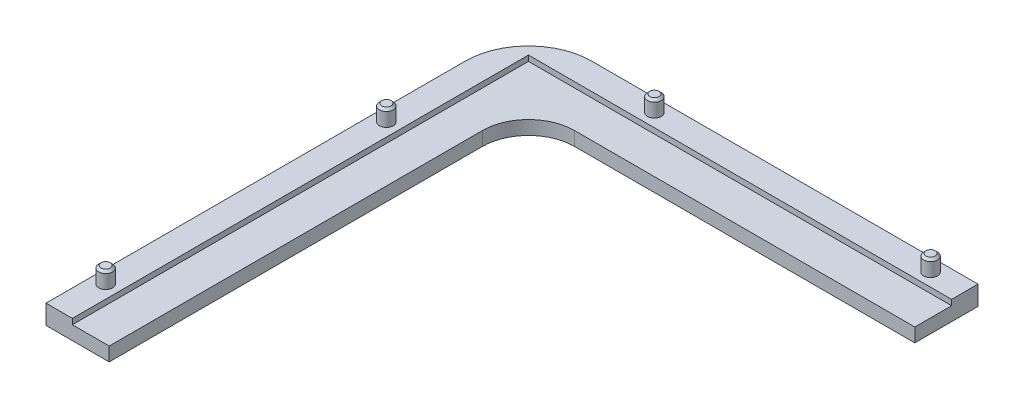
ISO-10303-21;
HEADER;
FILE_DESCRIPTION(('STEP AP214'),'2;1');
FILE_NAME('part.step','',(''),(''),'','','');
FILE_SCHEMA(('AUTOMOTIVE_DESIGN { 1 0 10303 214 1 1 1 1 }'));
ENDSEC;
DATA;
#1=APPLICATION_CONTEXT('core data for automotive mechanical design processes');
#2=APPLICATION_PROTOCOL_DEFINITION('international standard','automotive_design',2000,#1);
#3=PRODUCT_CONTEXT('',#1,'mechanical');
#4=PRODUCT('Part','Part','',(#3));
#5=PRODUCT_RELATED_PRODUCT_CATEGORY('part','',(#4));
#6=PRODUCT_DEFINITION_FORMATION('','',#4);
#7=PRODUCT_DEFINITION_CONTEXT('part definition',#1,'design');
#8=PRODUCT_DEFINITION('design','',#6,#7);
#9=PRODUCT_DEFINITION_SHAPE('','',#8);
#10=(LENGTH_UNIT() NAMED_UNIT(*) SI_UNIT(.MILLI.,.METRE.));
#11=(NAMED_UNIT(*) PLANE_ANGLE_UNIT() SI_UNIT($,.RADIAN.));
#12=(NAMED_UNIT(*) SI_UNIT($,.STERADIAN.) SOLID_ANGLE_UNIT());
#13=UNCERTAINTY_MEASURE_WITH_UNIT(LENGTH_MEASURE(1.E-05),#10,'distance_accuracy_value','');
#14=(GEOMETRIC_REPRESENTATION_CONTEXT(3) GLOBAL_UNCERTAINTY_ASSIGNED_CONTEXT((#13)) GLOBAL_UNIT_ASSIGNED_CONTEXT((#10,
#11,#12)) REPRESENTATION_CONTEXT('',''));
#15=CARTESIAN_POINT('',(0.,0.,0.));
#16=DIRECTION('',(0.,0.,1.));
#17=DIRECTION('',(1.,0.,0.));
#18=AXIS2_PLACEMENT_3D('',#15,#16,#17);
#19=CARTESIAN_POINT('',(114.5,-1.2,178.));
#20=DIRECTION('',(0.,-1.,0.));
#21=DIRECTION('',(0.,0.,-1.));
#22=AXIS2_PLACEMENT_3D('',#19,#20,#21);
#23=PLANE('',#22);
#24=DIRECTION('',(1.,0.,0.));
#25=VECTOR('',#24,1.);
#26=CARTESIAN_POINT('',(7.99999999999999,-1.2,8.00000000000001));
#27=LINE('',#26,#25);
#28=CARTESIAN_POINT('',(18.,-1.2,8.00000000000001));
#29=VERTEX_POINT('',#28);
#30=CARTESIAN_POINT('',(91.9392474706588,-1.19999999999999,8.00000000000001));
#31=VERTEX_POINT('',#30);
#32=EDGE_CURVE('E192',#29,#31,#27,.T.);
#33=ORIENTED_EDGE('',*,*,#32,.T.);
#34=DIRECTION('',(0.,0.,-1.));
#35=VECTOR('',#34,1.);
#36=CARTESIAN_POINT('',(91.9392474706588,-1.2,178.));
#37=LINE('',#36,#35);
#38=CARTESIAN_POINT('',(91.9392474706588,-1.2,0.));
#39=VERTEX_POINT('',#38);
#40=EDGE_CURVE('E188',#31,#39,#37,.T.);
#41=ORIENTED_EDGE('',*,*,#40,.T.);
#42=DIRECTION('',(1.,0.,0.));
#43=VECTOR('',#42,1.);
#44=CARTESIAN_POINT('',(7.99999999999999,-1.2,0.));
#45=LINE('',#44,#43);
#46=CARTESIAN_POINT('',(0.,-1.2,0.));
#47=VERTEX_POINT('',#46);
#48=EDGE_CURVE('E199',#47,#39,#45,.T.);
#49=ORIENTED_EDGE('',*,*,#48,.F.);
#50=DIRECTION('',(0.,0.,-1.));
#51=VECTOR('',#50,1.);
#52=CARTESIAN_POINT('',(0.,-1.2,170.));
#53=LINE('',#52,#51);
#54=CARTESIAN_POINT('',(0.,-1.2,99.0984832904773));
#55=VERTEX_POINT('',#54);
#56=EDGE_CURVE('E152',#55,#47,#53,.T.);
#57=ORIENTED_EDGE('',*,*,#56,.F.);
#58=DIRECTION('',(-1.,0.,0.));
#59=VECTOR('',#58,1.);
#60=CARTESIAN_POINT('',(114.5,-1.19999999999999,99.0984832904773));
#61=LINE('',#60,#59);
#62=CARTESIAN_POINT('',(8.00000000000002,-1.19999999999999,99.0984832904773));
#63=VERTEX_POINT('',#62);
#64=EDGE_CURVE('E203',#63,#55,#61,.T.);
#65=ORIENTED_EDGE('',*,*,#64,.F.);
#66=DIRECTION('',(0.,0.,-1.));
#67=VECTOR('',#66,1.);
#68=CARTESIAN_POINT('',(8.00000000000004,-1.2,170.));
#69=LINE('',#68,#67);
#70=CARTESIAN_POINT('',(8.00000000000002,-1.2,18.));
#71=VERTEX_POINT('',#70);
#72=EDGE_CURVE('E191',#63,#71,#69,.T.);
#73=ORIENTED_EDGE('',*,*,#72,.T.);
#74=CARTESIAN_POINT('',(18.,-1.19999999999999,18.));
#75=DIRECTION('',(0.,-1.,0.));
#76=DIRECTION('',(0.,0.,-1.));
#77=AXIS2_PLACEMENT_3D('',#74,#75,#76);
#78=CIRCLE('',#77,10.);
#79=EDGE_CURVE('E180',#71,#29,#78,.T.);
#80=ORIENTED_EDGE('',*,*,#79,.T.);
#81=EDGE_LOOP('',(#33,#41,#49,#57,#65,#73,#80));
#82=FACE_BOUND('',#81,.T.);
#83=ADVANCED_FACE('F44',(#82),#23,.F.);
#84=CARTESIAN_POINT('',(-5.72893887195666,-4.2,170.));
#85=DIRECTION('',(1.,0.,0.));
#86=DIRECTION('',(0.,0.,-1.));
#87=AXIS2_PLACEMENT_3D('',#84,#85,#86);
#88=PLANE('',#87);
#89=DIRECTION('',(0.,-1.,0.));
#90=VECTOR('',#89,1.);
#91=CARTESIAN_POINT('',(-5.72893887195667,-4.2,99.0984832904773));
#92=LINE('',#91,#90);
#93=CARTESIAN_POINT('',(-5.72893887195669,0.,99.0984832904773));
#94=VERTEX_POINT('',#93);
#95=CARTESIAN_POINT('',(-5.72893887195669,-4.2,99.0984832904773));
#96=VERTEX_POINT('',#95);
#97=EDGE_CURVE('E55',#94,#96,#92,.T.);
#98=ORIENTED_EDGE('',*,*,#97,.F.);
#99=DIRECTION('',(0.,0.,-1.));
#100=VECTOR('',#99,1.);
#101=CARTESIAN_POINT('',(-5.72893887195668,0.,183.728938871957));
#102=LINE('',#101,#100);
#103=CARTESIAN_POINT('',(-5.72893887195668,0.,8.));
#104=VERTEX_POINT('',#103);
#105=EDGE_CURVE('E174',#94,#104,#102,.T.);
#106=ORIENTED_EDGE('',*,*,#105,.T.);
#107=DIRECTION('',(0.,-1.,0.));
#108=VECTOR('',#107,1.);
#109=CARTESIAN_POINT('',(-5.72893887195669,-4.2,7.99999999999999));
#110=LINE('',#109,#108);
#111=CARTESIAN_POINT('',(-5.72893887195668,-4.2,7.99999999999998));
#112=VERTEX_POINT('',#111);
#113=EDGE_CURVE('E169',#104,#112,#110,.T.);
#114=ORIENTED_EDGE('',*,*,#113,.T.);
#115=DIRECTION('',(0.,0.,-1.));
#116=VECTOR('',#115,1.);
#117=CARTESIAN_POINT('',(-5.72893887195666,-4.2,170.));
#118=LINE('',#117,#116);
#119=EDGE_CURVE('E166',#96,#112,#118,.T.);
#120=ORIENTED_EDGE('',*,*,#119,.F.);
#121=EDGE_LOOP('',(#98,#106,#114,#120));
#122=FACE_BOUND('',#121,.T.);
#123=ADVANCED_FACE('F329',(#122),#88,.F.);
#124=CARTESIAN_POINT('',(8.00000000000004,-4.2,170.));
#125=DIRECTION('',(-1.,0.,0.));
#126=DIRECTION('',(0.,0.,1.));
#127=AXIS2_PLACEMENT_3D('',#124,#125,#126);
#128=PLANE('',#127);
#129=DIRECTION('',(0.,1.,0.));
#130=VECTOR('',#129,1.);
#131=CARTESIAN_POINT('',(8.00000000000003,-4.2,99.0984832904773));
#132=LINE('',#131,#130);
#133=CARTESIAN_POINT('',(8.00000000000004,-4.2,99.0984832904773));
#134=VERTEX_POINT('',#133);
#135=EDGE_CURVE('E200',#134,#63,#132,.T.);
#136=ORIENTED_EDGE('',*,*,#135,.F.);
#137=DIRECTION('',(0.,0.,-1.));
#138=VECTOR('',#137,1.);
#139=CARTESIAN_POINT('',(8.00000000000004,-4.2,170.));
#140=LINE('',#139,#138);
#141=CARTESIAN_POINT('',(8.00000000000002,-4.2,18.));
#142=VERTEX_POINT('',#141);
#143=EDGE_CURVE('E173',#134,#142,#140,.T.);
#144=ORIENTED_EDGE('',*,*,#143,.T.);
#145=DIRECTION('',(0.,1.,0.));
#146=VECTOR('',#145,1.);
#147=CARTESIAN_POINT('',(8.00000000000002,-1.2,18.));
#148=LINE('',#147,#146);
#149=EDGE_CURVE('E272',#142,#71,#148,.T.);
#150=ORIENTED_EDGE('',*,*,#149,.T.);
#151=ORIENTED_EDGE('',*,*,#72,.F.);
#152=EDGE_LOOP('',(#136,#144,#150,#151));
#153=FACE_BOUND('',#152,.T.);
#154=ADVANCED_FACE('F300',(#153),#128,.F.);
#155=CARTESIAN_POINT('',(0.,0.,170.));
#156=DIRECTION('',(-1.,0.,0.));
#157=DIRECTION('',(0.,0.,1.));
#158=AXIS2_PLACEMENT_3D('',#155,#156,#157);
#159=PLANE('',#158);
#160=DIRECTION('',(0.,1.,0.));
#161=VECTOR('',#160,1.);
#162=CARTESIAN_POINT('',(0.,0.,99.0984832904773));
#163=LINE('',#162,#161);
#164=CARTESIAN_POINT('',(0.,0.,99.0984832904773));
#165=VERTEX_POINT('',#164);
#166=EDGE_CURVE('E207',#55,#165,#163,.T.);
#167=ORIENTED_EDGE('',*,*,#166,.F.);
#168=ORIENTED_EDGE('',*,*,#56,.T.);
#169=DIRECTION('',(0.,1.,0.));
#170=VECTOR('',#169,1.);
#171=CARTESIAN_POINT('',(0.,-1.2,0.));
#172=LINE('',#171,#170);
#173=CARTESIAN_POINT('',(0.,0.,0.));
#174=VERTEX_POINT('',#173);
#175=EDGE_CURVE('E148',#47,#174,#172,.T.);
#176=ORIENTED_EDGE('',*,*,#175,.T.);
#177=DIRECTION('',(0.,0.,-1.));
#178=VECTOR('',#177,1.);
#179=CARTESIAN_POINT('',(0.,0.,170.));
#180=LINE('',#179,#178);
#181=EDGE_CURVE('E182',#165,#174,#180,.T.);
#182=ORIENTED_EDGE('',*,*,#181,.F.);
#183=EDGE_LOOP('',(#167,#168,#176,#182));
#184=FACE_BOUND('',#183,.T.);
#185=ADVANCED_FACE('F336',(#184),#159,.F.);
#186=CARTESIAN_POINT('',(221.,-4.2,170.));
#187=DIRECTION('',(0.,1.,0.));
#188=DIRECTION('',(0.,0.,1.));
#189=AXIS2_PLACEMENT_3D('',#186,#187,#188);
#190=PLANE('',#189);
#191=DIRECTION('',(1.,0.,0.));
#192=VECTOR('',#191,1.);
#193=CARTESIAN_POINT('',(7.99999999999999,-4.2,-5.72893887195669));
#194=LINE('',#193,#192);
#195=CARTESIAN_POINT('',(7.99999999999999,-4.2,-5.72893887195669));
#196=VERTEX_POINT('',#195);
#197=CARTESIAN_POINT('',(91.9392474706588,-4.2,-5.72893887195669));
#198=VERTEX_POINT('',#197);
#199=EDGE_CURVE('E134',#196,#198,#194,.T.);
#200=ORIENTED_EDGE('',*,*,#199,.T.);
#201=DIRECTION('',(0.,0.,1.));
#202=VECTOR('',#201,1.);
#203=CARTESIAN_POINT('',(91.9392474706588,-4.2,0.));
#204=LINE('',#203,#202);
#205=CARTESIAN_POINT('',(91.9392474706588,-4.2,8.00000000000001));
#206=VERTEX_POINT('',#205);
#207=EDGE_CURVE('E48',#198,#206,#204,.T.);
#208=ORIENTED_EDGE('',*,*,#207,.T.);
#209=DIRECTION('',(1.,0.,0.));
#210=VECTOR('',#209,1.);
#211=CARTESIAN_POINT('',(7.99999999999999,-4.2,8.00000000000001));
#212=LINE('',#211,#210);
#213=CARTESIAN_POINT('',(18.,-4.2,8.00000000000001));
#214=VERTEX_POINT('',#213);
#215=EDGE_CURVE('E143',#214,#206,#212,.T.);
#216=ORIENTED_EDGE('',*,*,#215,.F.);
#217=CARTESIAN_POINT('',(18.,-4.19999999999999,18.));
#218=DIRECTION('',(0.,1.,0.));
#219=DIRECTION('',(0.,0.,1.));
#220=AXIS2_PLACEMENT_3D('',#217,#218,#219);
#221=CIRCLE('',#220,10.);
#222=EDGE_CURVE('E133',#214,#142,#221,.T.);
#223=ORIENTED_EDGE('',*,*,#222,.T.);
#224=ORIENTED_EDGE('',*,*,#143,.F.);
#225=DIRECTION('',(1.,0.,0.));
#226=VECTOR('',#225,1.);
#227=CARTESIAN_POINT('',(0.,-4.2,99.0984832904773));
#228=LINE('',#227,#226);
#229=EDGE_CURVE('E11',#96,#134,#228,.T.);
#230=ORIENTED_EDGE('',*,*,#229,.F.);
#231=ORIENTED_EDGE('',*,*,#119,.T.);
#232=DIRECTION('',(1.,0.,0.));
#233=VECTOR('',#232,1.);
#234=CARTESIAN_POINT('',(8.00000000000001,-4.2,7.99999999999999));
#235=LINE('',#234,#233);
#236=CARTESIAN_POINT('',(8.00000000000001,-4.2,7.99999999999998));
#237=VERTEX_POINT('',#236);
#238=EDGE_CURVE('E156',#112,#237,#235,.T.);
#239=ORIENTED_EDGE('',*,*,#238,.T.);
#240=DIRECTION('',(0.,0.,1.));
#241=VECTOR('',#240,1.);
#242=CARTESIAN_POINT('',(7.99999999999999,-4.2,8.00000000000001));
#243=LINE('',#242,#241);
#244=EDGE_CURVE('E144',#196,#237,#243,.T.);
#245=ORIENTED_EDGE('',*,*,#244,.F.);
#246=EDGE_LOOP('',(#200,#208,#216,#223,#224,#230,#231,#239,#245));
#247=FACE_BOUND('',#246,.T.);
#248=ADVANCED_FACE('F46',(#247),#190,.F.);
#249=CARTESIAN_POINT('',(8.,0.,8.));
#250=DIRECTION('',(0.,-1.,0.));
#251=DIRECTION('',(0.,0.,-1.));
#252=AXIS2_PLACEMENT_3D('',#249,#250,#251);
#253=CYLINDRICAL_SURFACE('',#252,13.7289388719567);
#254=ORIENTED_EDGE('',*,*,#113,.F.);
#255=CARTESIAN_POINT('',(8.,0.,8.));
#256=DIRECTION('',(0.,-1.,0.));
#257=DIRECTION('',(0.,0.,-1.));
#258=AXIS2_PLACEMENT_3D('',#255,#256,#257);
#259=CIRCLE('',#258,13.7289388719567);
#260=CARTESIAN_POINT('',(7.99999999999998,0.,-5.72893887195669));
#261=VERTEX_POINT('',#260);
#262=EDGE_CURVE('E165',#104,#261,#259,.T.);
#263=ORIENTED_EDGE('',*,*,#262,.T.);
#264=DIRECTION('',(0.,-1.,0.));
#265=VECTOR('',#264,1.);
#266=CARTESIAN_POINT('',(7.99999999999999,-4.2,-5.72893887195669));
#267=LINE('',#266,#265);
#268=EDGE_CURVE('E162',#261,#196,#267,.T.);
#269=ORIENTED_EDGE('',*,*,#268,.T.);
#270=CARTESIAN_POINT('',(8.,-4.2,8.));
#271=DIRECTION('',(0.,-1.,0.));
#272=DIRECTION('',(-1.,0.,0.));
#273=AXIS2_PLACEMENT_3D('',#270,#271,#272);
#274=CIRCLE('',#273,13.7289388719567);
#275=EDGE_CURVE('E158',#112,#196,#274,.T.);
#276=ORIENTED_EDGE('',*,*,#275,.F.);
#277=EDGE_LOOP('',(#254,#263,#269,#276));
#278=FACE_BOUND('',#277,.T.);
#279=ADVANCED_FACE('F542',(#278),#253,.T.);
#280=CARTESIAN_POINT('',(8.00000000000001,-4.2,7.99999999999999));
#281=DIRECTION('',(0.,1.,0.));
#282=DIRECTION('',(0.,0.,1.));
#283=AXIS2_PLACEMENT_3D('',#280,#281,#282);
#284=PLANE('',#283);
#285=ORIENTED_EDGE('',*,*,#238,.F.);
#286=ORIENTED_EDGE('',*,*,#275,.T.);
#287=ORIENTED_EDGE('',*,*,#244,.T.);
#288=EDGE_LOOP('',(#285,#286,#287));
#289=FACE_BOUND('',#288,.T.);
#290=ADVANCED_FACE('F324',(#289),#284,.F.);
#291=CARTESIAN_POINT('',(7.99999999999999,-4.2,-5.72893887195669));
#292=DIRECTION('',(0.,0.,1.));
#293=DIRECTION('',(1.,0.,0.));
#294=AXIS2_PLACEMENT_3D('',#291,#292,#293);
#295=PLANE('',#294);
#296=DIRECTION('',(-1.,0.,0.));
#297=VECTOR('',#296,1.);
#298=CARTESIAN_POINT('',(234.728938871957,0.,-5.72893887195669));
#299=LINE('',#298,#297);
#300=CARTESIAN_POINT('',(91.9392474706588,0.,-5.72893887195669));
#301=VERTEX_POINT('',#300);
#302=EDGE_CURVE('E141',#301,#261,#299,.T.);
#303=ORIENTED_EDGE('',*,*,#302,.F.);
#304=DIRECTION('',(0.,-1.,0.));
#305=VECTOR('',#304,1.);
#306=CARTESIAN_POINT('',(91.9392474706588,-4.2,-5.72893887195669));
#307=LINE('',#306,#305);
#308=EDGE_CURVE('E125',#301,#198,#307,.T.);
#309=ORIENTED_EDGE('',*,*,#308,.T.);
#310=ORIENTED_EDGE('',*,*,#199,.F.);
#311=ORIENTED_EDGE('',*,*,#268,.F.);
#312=EDGE_LOOP('',(#303,#309,#310,#311));
#313=FACE_BOUND('',#312,.T.);
#314=ADVANCED_FACE('F138',(#313),#295,.F.);
#315=CARTESIAN_POINT('',(7.99999999999999,-4.2,8.00000000000001));
#316=DIRECTION('',(0.,0.,-1.));
#317=DIRECTION('',(-1.,0.,0.));
#318=AXIS2_PLACEMENT_3D('',#315,#316,#317);
#319=PLANE('',#318);
#320=ORIENTED_EDGE('',*,*,#215,.T.);
#321=DIRECTION('',(0.,1.,0.));
#322=VECTOR('',#321,1.);
#323=CARTESIAN_POINT('',(91.9392474706588,-4.2,8.00000000000001));
#324=LINE('',#323,#322);
#325=EDGE_CURVE('E62',#206,#31,#324,.T.);
#326=ORIENTED_EDGE('',*,*,#325,.T.);
#327=ORIENTED_EDGE('',*,*,#32,.F.);
#328=DIRECTION('',(0.,1.,0.));
#329=VECTOR('',#328,1.);
#330=CARTESIAN_POINT('',(18.,-4.2,8.00000000000001));
#331=LINE('',#330,#329);
#332=EDGE_CURVE('E187',#29,#214,#331,.F.);
#333=ORIENTED_EDGE('',*,*,#332,.T.);
#334=EDGE_LOOP('',(#320,#326,#327,#333));
#335=FACE_BOUND('',#334,.T.);
#336=ADVANCED_FACE('F313',(#335),#319,.F.);
#337=CARTESIAN_POINT('',(7.99999999999999,0.,0.));
#338=DIRECTION('',(0.,0.,-1.));
#339=DIRECTION('',(-1.,0.,0.));
#340=AXIS2_PLACEMENT_3D('',#337,#338,#339);
#341=PLANE('',#340);
#342=ORIENTED_EDGE('',*,*,#48,.T.);
#343=DIRECTION('',(0.,1.,0.));
#344=VECTOR('',#343,1.);
#345=CARTESIAN_POINT('',(91.9392474706588,0.,0.));
#346=LINE('',#345,#344);
#347=CARTESIAN_POINT('',(91.9392474706588,0.,0.));
#348=VERTEX_POINT('',#347);
#349=EDGE_CURVE('E194',#39,#348,#346,.T.);
#350=ORIENTED_EDGE('',*,*,#349,.T.);
#351=DIRECTION('',(1.,0.,0.));
#352=VECTOR('',#351,1.);
#353=CARTESIAN_POINT('',(7.99999999999999,0.,0.));
#354=LINE('',#353,#352);
#355=EDGE_CURVE('E198',#174,#348,#354,.T.);
#356=ORIENTED_EDGE('',*,*,#355,.F.);
#357=ORIENTED_EDGE('',*,*,#175,.F.);
#358=EDGE_LOOP('',(#342,#350,#356,#357));
#359=FACE_BOUND('',#358,.T.);
#360=ADVANCED_FACE('F315',(#359),#341,.F.);
#361=CARTESIAN_POINT('',(234.728938871957,0.,183.728938871957));
#362=DIRECTION('',(0.,-1.,0.));
#363=DIRECTION('',(0.,0.,-1.));
#364=AXIS2_PLACEMENT_3D('',#361,#362,#363);
#365=PLANE('',#364);
#366=CARTESIAN_POINT('',(84.5,0.,-2.86446943597835));
#367=DIRECTION('',(0.,-1.,0.));
#368=DIRECTION('',(0.,0.,-1.));
#369=AXIS2_PLACEMENT_3D('',#366,#367,#368);
#370=CIRCLE('',#369,1.5);
#371=CARTESIAN_POINT('',(84.5,0.,-4.36446943597834));
#372=VERTEX_POINT('',#371);
#373=EDGE_CURVE('E224',#372,#372,#370,.F.);
#374=ORIENTED_EDGE('',*,*,#373,.F.);
#375=EDGE_LOOP('',(#374));
#376=FACE_BOUND('',#375,.T.);
#377=CARTESIAN_POINT('',(-2.86446943598476,0.,88.9999999999993));
#378=DIRECTION('',(0.,-1.,0.));
#379=DIRECTION('',(0.,0.,-1.));
#380=AXIS2_PLACEMENT_3D('',#377,#378,#379);
#381=CIRCLE('',#380,1.5);
#382=CARTESIAN_POINT('',(-2.86446943598476,0.,87.4999999999993));
#383=VERTEX_POINT('',#382);
#384=EDGE_CURVE('E243',#383,#383,#381,.F.);
#385=ORIENTED_EDGE('',*,*,#384,.F.);
#386=EDGE_LOOP('',(#385));
#387=FACE_BOUND('',#386,.T.);
#388=CARTESIAN_POINT('',(-2.86446943597834,0.,28.));
#389=DIRECTION('',(0.,-1.,0.));
#390=DIRECTION('',(0.,0.,-1.));
#391=AXIS2_PLACEMENT_3D('',#388,#389,#390);
#392=CIRCLE('',#391,1.5);
#393=CARTESIAN_POINT('',(-2.86446943597834,0.,26.5));
#394=VERTEX_POINT('',#393);
#395=EDGE_CURVE('E251',#394,#394,#392,.F.);
#396=ORIENTED_EDGE('',*,*,#395,.F.);
#397=EDGE_LOOP('',(#396));
#398=FACE_BOUND('',#397,.T.);
#399=CARTESIAN_POINT('',(24.5,0.,-2.86446943597835));
#400=DIRECTION('',(0.,-1.,0.));
#401=DIRECTION('',(0.,0.,-1.));
#402=AXIS2_PLACEMENT_3D('',#399,#400,#401);
#403=CIRCLE('',#402,1.5);
#404=CARTESIAN_POINT('',(24.5,0.,-4.36446943597835));
#405=VERTEX_POINT('',#404);
#406=EDGE_CURVE('E233',#405,#405,#403,.F.);
#407=ORIENTED_EDGE('',*,*,#406,.F.);
#408=EDGE_LOOP('',(#407));
#409=FACE_BOUND('',#408,.T.);
#410=ORIENTED_EDGE('',*,*,#355,.T.);
#411=DIRECTION('',(0.,0.,-1.));
#412=VECTOR('',#411,1.);
#413=CARTESIAN_POINT('',(91.9392474706588,0.,183.728938871957));
#414=LINE('',#413,#412);
#415=EDGE_CURVE('E183',#348,#301,#414,.T.);
#416=ORIENTED_EDGE('',*,*,#415,.T.);
#417=ORIENTED_EDGE('',*,*,#302,.T.);
#418=ORIENTED_EDGE('',*,*,#262,.F.);
#419=ORIENTED_EDGE('',*,*,#105,.F.);
#420=DIRECTION('',(-1.,0.,0.));
#421=VECTOR('',#420,1.);
#422=CARTESIAN_POINT('',(234.728938871957,0.,99.0984832904773));
#423=LINE('',#422,#421);
#424=EDGE_CURVE('E210',#165,#94,#423,.T.);
#425=ORIENTED_EDGE('',*,*,#424,.F.);
#426=ORIENTED_EDGE('',*,*,#181,.T.);
#427=EDGE_LOOP('',(#410,#416,#417,#418,#419,#425,#426));
#428=FACE_BOUND('',#427,.T.);
#429=ADVANCED_FACE('F321',(#376,#387,#398,#409,#428),#365,.F.);
#430=CARTESIAN_POINT('',(18.,-4.2,18.));
#431=DIRECTION('',(0.,-1.,0.));
#432=DIRECTION('',(0.,0.,-1.));
#433=AXIS2_PLACEMENT_3D('',#430,#431,#432);
#434=CYLINDRICAL_SURFACE('',#433,10.);
#435=ORIENTED_EDGE('',*,*,#222,.F.);
#436=ORIENTED_EDGE('',*,*,#332,.F.);
#437=ORIENTED_EDGE('',*,*,#79,.F.);
#438=ORIENTED_EDGE('',*,*,#149,.F.);
#439=EDGE_LOOP('',(#435,#436,#437,#438));
#440=FACE_BOUND('',#439,.T.);
#441=ADVANCED_FACE('F308',(#440),#434,.F.);
#442=CARTESIAN_POINT('',(24.5,3.5,-2.86446943597835));
#443=DIRECTION('',(0.,-1.,0.));
#444=DIRECTION('',(0.,0.,-1.));
#445=AXIS2_PLACEMENT_3D('',#442,#443,#444);
#446=CYLINDRICAL_SURFACE('',#445,1.5);
#447=CARTESIAN_POINT('',(24.5,3.,-2.86446943597835));
#448=DIRECTION('',(0.,1.,0.));
#449=DIRECTION('',(0.,0.,1.));
#450=AXIS2_PLACEMENT_3D('',#447,#448,#449);
#451=CIRCLE('',#450,1.5);
#452=CARTESIAN_POINT('',(24.5,3.,-1.36446943597834));
#453=VERTEX_POINT('',#452);
#454=EDGE_CURVE('E229',#453,#453,#451,.F.);
#455=ORIENTED_EDGE('',*,*,#454,.T.);
#456=EDGE_LOOP('',(#455));
#457=FACE_BOUND('',#456,.T.);
#458=ORIENTED_EDGE('',*,*,#406,.T.);
#459=EDGE_LOOP('',(#458));
#460=FACE_BOUND('',#459,.T.);
#461=ADVANCED_FACE('F342',(#457,#460),#446,.T.);
#462=CARTESIAN_POINT('',(24.5,3.5,-2.86446943597835));
#463=DIRECTION('',(0.,1.,0.));
#464=DIRECTION('',(0.,0.,1.));
#465=AXIS2_PLACEMENT_3D('',#462,#463,#464);
#466=PLANE('',#465);
#467=CARTESIAN_POINT('',(24.5,3.5,-2.86446943597835));
#468=DIRECTION('',(0.,1.,0.));
#469=DIRECTION('',(0.,0.,1.));
#470=AXIS2_PLACEMENT_3D('',#467,#468,#469);
#471=CIRCLE('',#470,1.);
#472=CARTESIAN_POINT('',(24.5,3.5,-1.86446943597834));
#473=VERTEX_POINT('',#472);
#474=EDGE_CURVE('E234',#473,#473,#471,.T.);
#475=ORIENTED_EDGE('',*,*,#474,.T.);
#476=EDGE_LOOP('',(#475));
#477=FACE_BOUND('',#476,.T.);
#478=ADVANCED_FACE('F474',(#477),#466,.T.);
#479=CARTESIAN_POINT('',(-2.86446943597834,3.5,28.));
#480=DIRECTION('',(0.,-1.,0.));
#481=DIRECTION('',(0.,0.,-1.));
#482=AXIS2_PLACEMENT_3D('',#479,#480,#481);
#483=CYLINDRICAL_SURFACE('',#482,1.5);
#484=CARTESIAN_POINT('',(-2.86446943597834,2.99999999999998,28.));
#485=DIRECTION('',(0.,1.,0.));
#486=DIRECTION('',(0.,0.,1.));
#487=AXIS2_PLACEMENT_3D('',#484,#485,#486);
#488=CIRCLE('',#487,1.5);
#489=CARTESIAN_POINT('',(-2.86446943597834,2.99999999999998,29.5));
#490=VERTEX_POINT('',#489);
#491=EDGE_CURVE('E238',#490,#490,#488,.F.);
#492=ORIENTED_EDGE('',*,*,#491,.T.);
#493=EDGE_LOOP('',(#492));
#494=FACE_BOUND('',#493,.T.);
#495=ORIENTED_EDGE('',*,*,#395,.T.);
#496=EDGE_LOOP('',(#495));
#497=FACE_BOUND('',#496,.T.);
#498=ADVANCED_FACE('F463',(#494,#497),#483,.T.);
#499=CARTESIAN_POINT('',(-2.86446943597834,3.5,28.));
#500=DIRECTION('',(0.,1.,0.));
#501=DIRECTION('',(0.,0.,1.));
#502=AXIS2_PLACEMENT_3D('',#499,#500,#501);
#503=PLANE('',#502);
#504=CARTESIAN_POINT('',(-2.86446943597834,3.5,28.));
#505=DIRECTION('',(0.,1.,0.));
#506=DIRECTION('',(0.,0.,1.));
#507=AXIS2_PLACEMENT_3D('',#504,#505,#506);
#508=CIRCLE('',#507,1.);
#509=CARTESIAN_POINT('',(-2.86446943597834,3.5,29.));
#510=VERTEX_POINT('',#509);
#511=EDGE_CURVE('E244',#510,#510,#508,.T.);
#512=ORIENTED_EDGE('',*,*,#511,.T.);
#513=EDGE_LOOP('',(#512));
#514=FACE_BOUND('',#513,.T.);
#515=ADVANCED_FACE('F453',(#514),#503,.T.);
#516=CARTESIAN_POINT('',(-2.86446943598476,3.5,88.9999999999993));
#517=DIRECTION('',(0.,-1.,0.));
#518=DIRECTION('',(0.,0.,-1.));
#519=AXIS2_PLACEMENT_3D('',#516,#517,#518);
#520=CYLINDRICAL_SURFACE('',#519,1.5);
#521=CARTESIAN_POINT('',(-2.86446943598476,3.,88.9999999999993));
#522=DIRECTION('',(0.,1.,0.));
#523=DIRECTION('',(0.,0.,1.));
#524=AXIS2_PLACEMENT_3D('',#521,#522,#523);
#525=CIRCLE('',#524,1.5);
#526=CARTESIAN_POINT('',(-2.86446943598476,3.,90.4999999999993));
#527=VERTEX_POINT('',#526);
#528=EDGE_CURVE('E239',#527,#527,#525,.F.);
#529=ORIENTED_EDGE('',*,*,#528,.T.);
#530=EDGE_LOOP('',(#529));
#531=FACE_BOUND('',#530,.T.);
#532=ORIENTED_EDGE('',*,*,#384,.T.);
#533=EDGE_LOOP('',(#532));
#534=FACE_BOUND('',#533,.T.);
#535=ADVANCED_FACE('F390',(#531,#534),#520,.T.);
#536=CARTESIAN_POINT('',(-2.86446943598476,3.5,88.9999999999993));
#537=DIRECTION('',(0.,1.,0.));
#538=DIRECTION('',(0.,0.,1.));
#539=AXIS2_PLACEMENT_3D('',#536,#537,#538);
#540=PLANE('',#539);
#541=CARTESIAN_POINT('',(-2.86446943598476,3.5,88.9999999999993));
#542=DIRECTION('',(0.,1.,0.));
#543=DIRECTION('',(0.,0.,1.));
#544=AXIS2_PLACEMENT_3D('',#541,#542,#543);
#545=CIRCLE('',#544,1.);
#546=CARTESIAN_POINT('',(-2.86446943598476,3.5,89.9999999999993));
#547=VERTEX_POINT('',#546);
#548=EDGE_CURVE('E225',#547,#547,#545,.T.);
#549=ORIENTED_EDGE('',*,*,#548,.T.);
#550=EDGE_LOOP('',(#549));
#551=FACE_BOUND('',#550,.T.);
#552=ADVANCED_FACE('F386',(#551),#540,.T.);
#553=CARTESIAN_POINT('',(84.5,3.5,-2.86446943597835));
#554=DIRECTION('',(0.,-1.,0.));
#555=DIRECTION('',(0.,0.,-1.));
#556=AXIS2_PLACEMENT_3D('',#553,#554,#555);
#557=CYLINDRICAL_SURFACE('',#556,1.5);
#558=CARTESIAN_POINT('',(84.5,3.,-2.86446943597835));
#559=DIRECTION('',(0.,1.,0.));
#560=DIRECTION('',(0.,0.,1.));
#561=AXIS2_PLACEMENT_3D('',#558,#559,#560);
#562=CIRCLE('',#561,1.5);
#563=CARTESIAN_POINT('',(84.5,3.,-1.36446943597835));
#564=VERTEX_POINT('',#563);
#565=EDGE_CURVE('E220',#564,#564,#562,.F.);
#566=ORIENTED_EDGE('',*,*,#565,.T.);
#567=EDGE_LOOP('',(#566));
#568=FACE_BOUND('',#567,.T.);
#569=ORIENTED_EDGE('',*,*,#373,.T.);
#570=EDGE_LOOP('',(#569));
#571=FACE_BOUND('',#570,.T.);
#572=ADVANCED_FACE('F381',(#568,#571),#557,.T.);
#573=CARTESIAN_POINT('',(84.5,3.5,-2.86446943597835));
#574=DIRECTION('',(0.,1.,0.));
#575=DIRECTION('',(0.,0.,1.));
#576=AXIS2_PLACEMENT_3D('',#573,#574,#575);
#577=PLANE('',#576);
#578=CARTESIAN_POINT('',(84.5,3.5,-2.86446943597835));
#579=DIRECTION('',(0.,1.,0.));
#580=DIRECTION('',(0.,0.,1.));
#581=AXIS2_PLACEMENT_3D('',#578,#579,#580);
#582=CIRCLE('',#581,1.);
#583=CARTESIAN_POINT('',(84.5,3.5,-1.86446943597834));
#584=VERTEX_POINT('',#583);
#585=EDGE_CURVE('E204',#584,#584,#582,.T.);
#586=ORIENTED_EDGE('',*,*,#585,.T.);
#587=EDGE_LOOP('',(#586));
#588=FACE_BOUND('',#587,.T.);
#589=ADVANCED_FACE('F351',(#588),#577,.T.);
#590=CARTESIAN_POINT('',(-2.86446943597834,3.5,28.));
#591=DIRECTION('',(0.,-1.,0.));
#592=DIRECTION('',(0.,0.,-1.));
#593=AXIS2_PLACEMENT_3D('',#590,#591,#592);
#594=CONICAL_SURFACE('',#593,1.,0.785398163397433);
#595=ORIENTED_EDGE('',*,*,#491,.F.);
#596=EDGE_LOOP('',(#595));
#597=FACE_BOUND('',#596,.T.);
#598=ORIENTED_EDGE('',*,*,#511,.F.);
#599=EDGE_LOOP('',(#598));
#600=FACE_BOUND('',#599,.T.);
#601=ADVANCED_FACE('F344',(#597,#600),#594,.T.);
#602=CARTESIAN_POINT('',(-2.86446943598476,3.5,88.9999999999993));
#603=DIRECTION('',(0.,-1.,0.));
#604=DIRECTION('',(0.,0.,-1.));
#605=AXIS2_PLACEMENT_3D('',#602,#603,#604);
#606=CONICAL_SURFACE('',#605,1.,0.785398163397453);
#607=ORIENTED_EDGE('',*,*,#528,.F.);
#608=EDGE_LOOP('',(#607));
#609=FACE_BOUND('',#608,.T.);
#610=ORIENTED_EDGE('',*,*,#548,.F.);
#611=EDGE_LOOP('',(#610));
#612=FACE_BOUND('',#611,.T.);
#613=ADVANCED_FACE('F350',(#609,#612),#606,.T.);
#614=CARTESIAN_POINT('',(24.5,3.5,-2.86446943597835));
#615=DIRECTION('',(0.,-1.,0.));
#616=DIRECTION('',(0.,0.,-1.));
#617=AXIS2_PLACEMENT_3D('',#614,#615,#616);
#618=CONICAL_SURFACE('',#617,1.,0.785398163397443);
#619=ORIENTED_EDGE('',*,*,#454,.F.);
#620=EDGE_LOOP('',(#619));
#621=FACE_BOUND('',#620,.T.);
#622=ORIENTED_EDGE('',*,*,#474,.F.);
#623=EDGE_LOOP('',(#622));
#624=FACE_BOUND('',#623,.T.);
#625=ADVANCED_FACE('F358',(#621,#624),#618,.T.);
#626=CARTESIAN_POINT('',(84.5,3.5,-2.86446943597835));
#627=DIRECTION('',(0.,-1.,0.));
#628=DIRECTION('',(0.,0.,-1.));
#629=AXIS2_PLACEMENT_3D('',#626,#627,#628);
#630=CONICAL_SURFACE('',#629,1.,0.785398163397443);
#631=ORIENTED_EDGE('',*,*,#565,.F.);
#632=EDGE_LOOP('',(#631));
#633=FACE_BOUND('',#632,.T.);
#634=ORIENTED_EDGE('',*,*,#585,.F.);
#635=EDGE_LOOP('',(#634));
#636=FACE_BOUND('',#635,.T.);
#637=ADVANCED_FACE('F365',(#633,#636),#630,.T.);
#638=CARTESIAN_POINT('',(0.,-4.2,99.0984832904773));
#639=DIRECTION('',(0.,0.,1.));
#640=DIRECTION('',(1.,0.,0.));
#641=AXIS2_PLACEMENT_3D('',#638,#639,#640);
#642=PLANE('',#641);
#643=ORIENTED_EDGE('',*,*,#135,.T.);
#644=ORIENTED_EDGE('',*,*,#64,.T.);
#645=ORIENTED_EDGE('',*,*,#166,.T.);
#646=ORIENTED_EDGE('',*,*,#424,.T.);
#647=ORIENTED_EDGE('',*,*,#97,.T.);
#648=ORIENTED_EDGE('',*,*,#229,.T.);
#649=EDGE_LOOP('',(#643,#644,#645,#646,#647,#648));
#650=FACE_BOUND('',#649,.T.);
#651=ADVANCED_FACE('F370',(#650),#642,.T.);
#652=CARTESIAN_POINT('',(91.9392474706588,-4.2,0.));
#653=DIRECTION('',(-1.,0.,0.));
#654=DIRECTION('',(0.,0.,1.));
#655=AXIS2_PLACEMENT_3D('',#652,#653,#654);
#656=PLANE('',#655);
#657=ORIENTED_EDGE('',*,*,#207,.F.);
#658=ORIENTED_EDGE('',*,*,#308,.F.);
#659=ORIENTED_EDGE('',*,*,#415,.F.);
#660=ORIENTED_EDGE('',*,*,#349,.F.);
#661=ORIENTED_EDGE('',*,*,#40,.F.);
#662=ORIENTED_EDGE('',*,*,#325,.F.);
#663=EDGE_LOOP('',(#657,#658,#659,#660,#661,#662));
#664=FACE_BOUND('',#663,.T.);
#665=ADVANCED_FACE('F127',(#664),#656,.F.);
#666=CLOSED_SHELL('',(#83,#123,#154,#185,#248,#279,#290,#314,#336,#360,#429,#441,#461,#478,#498,
#515,#535,#552,#572,#589,#601,#613,#625,#637,#651,#665));
#667=MANIFOLD_SOLID_BREP('B2',#666);
#668=ADVANCED_BREP_SHAPE_REPRESENTATION('',(#18,#667),#14);
#669=SHAPE_DEFINITION_REPRESENTATION(#9,#668);
ENDSEC;
END-ISO-10303-21;
